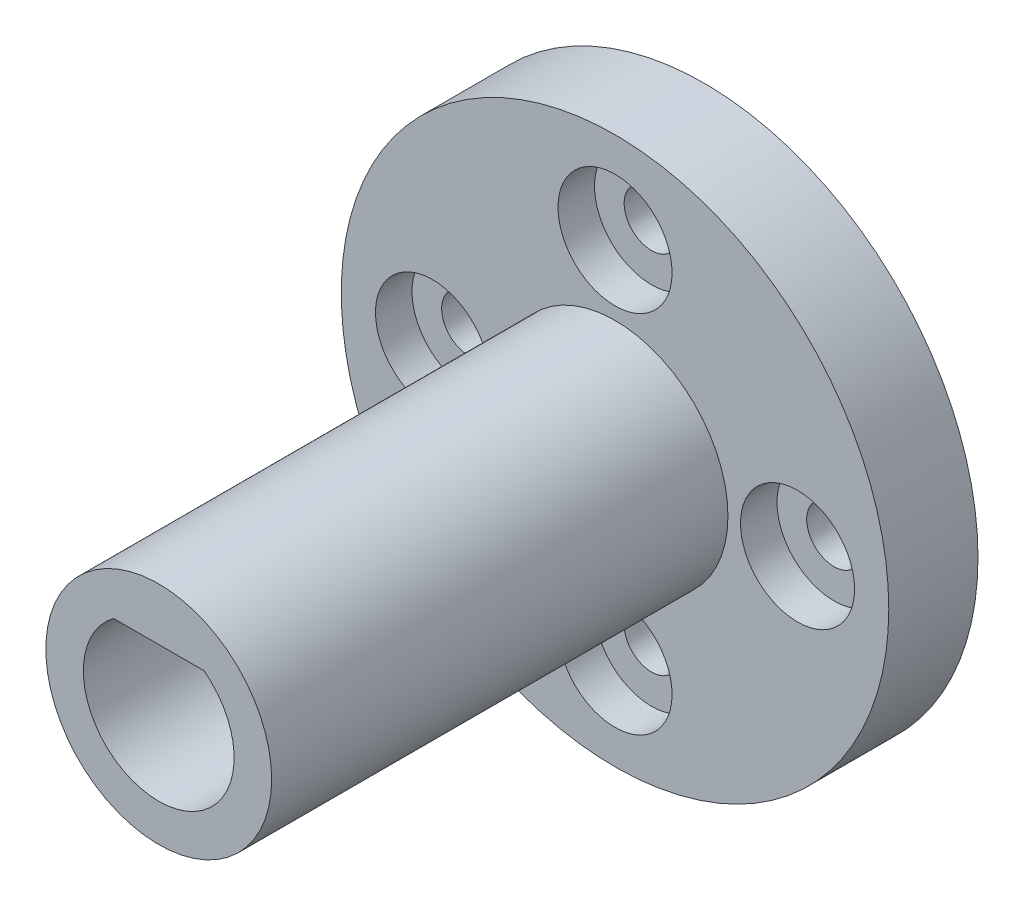
ISO-10303-21;
HEADER;
FILE_DESCRIPTION(('STEP AP214'),'2;1');
FILE_NAME('part.step','',(''),(''),'','','');
FILE_SCHEMA(('AUTOMOTIVE_DESIGN { 1 0 10303 214 1 1 1 1 }'));
ENDSEC;
DATA;
#1=APPLICATION_CONTEXT('core data for automotive mechanical design processes');
#2=APPLICATION_PROTOCOL_DEFINITION('international standard','automotive_design',2000,#1);
#3=PRODUCT_CONTEXT('',#1,'mechanical');
#4=PRODUCT('Part','Part','',(#3));
#5=PRODUCT_RELATED_PRODUCT_CATEGORY('part','',(#4));
#6=PRODUCT_DEFINITION_FORMATION('','',#4);
#7=PRODUCT_DEFINITION_CONTEXT('part definition',#1,'design');
#8=PRODUCT_DEFINITION('design','',#6,#7);
#9=PRODUCT_DEFINITION_SHAPE('','',#8);
#10=(LENGTH_UNIT() NAMED_UNIT(*) SI_UNIT(.MILLI.,.METRE.));
#11=(NAMED_UNIT(*) PLANE_ANGLE_UNIT() SI_UNIT($,.RADIAN.));
#12=(NAMED_UNIT(*) SI_UNIT($,.STERADIAN.) SOLID_ANGLE_UNIT());
#13=UNCERTAINTY_MEASURE_WITH_UNIT(LENGTH_MEASURE(1.E-05),#10,'distance_accuracy_value','');
#14=(GEOMETRIC_REPRESENTATION_CONTEXT(3) GLOBAL_UNCERTAINTY_ASSIGNED_CONTEXT((#13)) GLOBAL_UNIT_ASSIGNED_CONTEXT((#10,
#11,#12)) REPRESENTATION_CONTEXT('',''));
#15=CARTESIAN_POINT('',(0.,0.,0.));
#16=DIRECTION('',(0.,0.,1.));
#17=DIRECTION('',(1.,0.,0.));
#18=AXIS2_PLACEMENT_3D('',#15,#16,#17);
#19=CARTESIAN_POINT('',(0.,0.,3.91));
#20=DIRECTION('',(0.,0.,-1.));
#21=DIRECTION('',(-1.,0.,0.));
#22=AXIS2_PLACEMENT_3D('',#19,#20,#21);
#23=CYLINDRICAL_SURFACE('',#22,12.);
#24=CARTESIAN_POINT('',(0.,0.,3.91));
#25=DIRECTION('',(0.,0.,1.));
#26=DIRECTION('',(1.,0.,0.));
#27=AXIS2_PLACEMENT_3D('',#24,#25,#26);
#28=CIRCLE('',#27,12.);
#29=CARTESIAN_POINT('',(12.,0.,3.91));
#30=VERTEX_POINT('',#29);
#31=EDGE_CURVE('E11',#30,#30,#28,.T.);
#32=ORIENTED_EDGE('',*,*,#31,.F.);
#33=EDGE_LOOP('',(#32));
#34=FACE_BOUND('',#33,.T.);
#35=CARTESIAN_POINT('',(0.,0.,0.));
#36=DIRECTION('',(0.,0.,1.));
#37=DIRECTION('',(1.,0.,0.));
#38=AXIS2_PLACEMENT_3D('',#35,#36,#37);
#39=CIRCLE('',#38,12.);
#40=CARTESIAN_POINT('',(12.,0.,0.));
#41=VERTEX_POINT('',#40);
#42=EDGE_CURVE('E40',#41,#41,#39,.T.);
#43=ORIENTED_EDGE('',*,*,#42,.T.);
#44=EDGE_LOOP('',(#43));
#45=FACE_BOUND('',#44,.T.);
#46=ADVANCED_FACE('F37',(#34,#45),#23,.T.);
#47=CARTESIAN_POINT('',(0.,0.,3.91));
#48=DIRECTION('',(0.,0.,1.));
#49=DIRECTION('',(1.,0.,0.));
#50=AXIS2_PLACEMENT_3D('',#47,#48,#49);
#51=PLANE('',#50);
#52=CARTESIAN_POINT('',(8.,0.,3.91));
#53=DIRECTION('',(0.,0.,1.));
#54=DIRECTION('',(1.,0.,0.));
#55=AXIS2_PLACEMENT_3D('',#52,#53,#54);
#56=CIRCLE('',#55,2.5);
#57=CARTESIAN_POINT('',(10.5,0.,3.91));
#58=VERTEX_POINT('',#57);
#59=EDGE_CURVE('E307',#58,#58,#56,.T.);
#60=ORIENTED_EDGE('',*,*,#59,.F.);
#61=EDGE_LOOP('',(#60));
#62=FACE_BOUND('',#61,.T.);
#63=CARTESIAN_POINT('',(0.,-8.,3.91));
#64=DIRECTION('',(0.,0.,1.));
#65=DIRECTION('',(1.,0.,0.));
#66=AXIS2_PLACEMENT_3D('',#63,#64,#65);
#67=CIRCLE('',#66,2.5);
#68=CARTESIAN_POINT('',(2.5,-8.,3.91));
#69=VERTEX_POINT('',#68);
#70=EDGE_CURVE('E317',#69,#69,#67,.T.);
#71=ORIENTED_EDGE('',*,*,#70,.F.);
#72=EDGE_LOOP('',(#71));
#73=FACE_BOUND('',#72,.T.);
#74=CARTESIAN_POINT('',(-8.,0.,3.91));
#75=DIRECTION('',(0.,0.,1.));
#76=DIRECTION('',(1.,0.,0.));
#77=AXIS2_PLACEMENT_3D('',#74,#75,#76);
#78=CIRCLE('',#77,2.5);
#79=CARTESIAN_POINT('',(-5.50000000000001,0.,3.91));
#80=VERTEX_POINT('',#79);
#81=EDGE_CURVE('E329',#80,#80,#78,.T.);
#82=ORIENTED_EDGE('',*,*,#81,.F.);
#83=EDGE_LOOP('',(#82));
#84=FACE_BOUND('',#83,.T.);
#85=CARTESIAN_POINT('',(0.,8.,3.91));
#86=DIRECTION('',(0.,0.,1.));
#87=DIRECTION('',(1.,0.,0.));
#88=AXIS2_PLACEMENT_3D('',#85,#86,#87);
#89=CIRCLE('',#88,2.5);
#90=CARTESIAN_POINT('',(2.5,8.,3.91));
#91=VERTEX_POINT('',#90);
#92=EDGE_CURVE('E341',#91,#91,#89,.T.);
#93=ORIENTED_EDGE('',*,*,#92,.F.);
#94=EDGE_LOOP('',(#93));
#95=FACE_BOUND('',#94,.T.);
#96=CARTESIAN_POINT('',(0.,0.,3.91));
#97=DIRECTION('',(0.,0.,1.));
#98=DIRECTION('',(1.,0.,0.));
#99=AXIS2_PLACEMENT_3D('',#96,#97,#98);
#100=CIRCLE('',#99,4.95);
#101=CARTESIAN_POINT('',(4.95,0.,3.91));
#102=VERTEX_POINT('',#101);
#103=EDGE_CURVE('E77',#102,#102,#100,.T.);
#104=ORIENTED_EDGE('',*,*,#103,.F.);
#105=EDGE_LOOP('',(#104));
#106=FACE_BOUND('',#105,.T.);
#107=ORIENTED_EDGE('',*,*,#31,.T.);
#108=EDGE_LOOP('',(#107));
#109=FACE_BOUND('',#108,.T.);
#110=ADVANCED_FACE('F96',(#62,#73,#84,#95,#106,#109),#51,.T.);
#111=CARTESIAN_POINT('',(0.,0.,0.));
#112=DIRECTION('',(0.,0.,1.));
#113=DIRECTION('',(1.,0.,0.));
#114=AXIS2_PLACEMENT_3D('',#111,#112,#113);
#115=PLANE('',#114);
#116=CARTESIAN_POINT('',(8.,0.,0.));
#117=DIRECTION('',(0.,0.,1.));
#118=DIRECTION('',(1.,0.,0.));
#119=AXIS2_PLACEMENT_3D('',#116,#117,#118);
#120=CIRCLE('',#119,1.2);
#121=CARTESIAN_POINT('',(9.2,0.,0.));
#122=VERTEX_POINT('',#121);
#123=EDGE_CURVE('E314',#122,#122,#120,.T.);
#124=ORIENTED_EDGE('',*,*,#123,.T.);
#125=EDGE_LOOP('',(#124));
#126=FACE_BOUND('',#125,.T.);
#127=CARTESIAN_POINT('',(0.,-8.,0.));
#128=DIRECTION('',(0.,0.,1.));
#129=DIRECTION('',(1.,0.,0.));
#130=AXIS2_PLACEMENT_3D('',#127,#128,#129);
#131=CIRCLE('',#130,1.2);
#132=CARTESIAN_POINT('',(1.2,-8.,0.));
#133=VERTEX_POINT('',#132);
#134=EDGE_CURVE('E326',#133,#133,#131,.T.);
#135=ORIENTED_EDGE('',*,*,#134,.T.);
#136=EDGE_LOOP('',(#135));
#137=FACE_BOUND('',#136,.T.);
#138=CARTESIAN_POINT('',(-8.,0.,0.));
#139=DIRECTION('',(0.,0.,1.));
#140=DIRECTION('',(1.,0.,0.));
#141=AXIS2_PLACEMENT_3D('',#138,#139,#140);
#142=CIRCLE('',#141,1.2);
#143=CARTESIAN_POINT('',(-6.8,0.,0.));
#144=VERTEX_POINT('',#143);
#145=EDGE_CURVE('E338',#144,#144,#142,.T.);
#146=ORIENTED_EDGE('',*,*,#145,.T.);
#147=EDGE_LOOP('',(#146));
#148=FACE_BOUND('',#147,.T.);
#149=CARTESIAN_POINT('',(0.,8.,0.));
#150=DIRECTION('',(0.,0.,1.));
#151=DIRECTION('',(1.,0.,0.));
#152=AXIS2_PLACEMENT_3D('',#149,#150,#151);
#153=CIRCLE('',#152,1.2);
#154=CARTESIAN_POINT('',(1.2,8.,0.));
#155=VERTEX_POINT('',#154);
#156=EDGE_CURVE('E67',#155,#155,#153,.T.);
#157=ORIENTED_EDGE('',*,*,#156,.T.);
#158=EDGE_LOOP('',(#157));
#159=FACE_BOUND('',#158,.T.);
#160=CARTESIAN_POINT('',(0.,0.,0.));
#161=DIRECTION('',(0.,0.,-1.));
#162=DIRECTION('',(-1.,0.,0.));
#163=AXIS2_PLACEMENT_3D('',#160,#161,#162);
#164=CIRCLE('',#163,4.);
#165=CARTESIAN_POINT('',(-4.,0.,0.));
#166=VERTEX_POINT('',#165);
#167=EDGE_CURVE('E84',#166,#166,#164,.T.);
#168=ORIENTED_EDGE('',*,*,#167,.F.);
#169=EDGE_LOOP('',(#168));
#170=FACE_BOUND('',#169,.T.);
#171=ORIENTED_EDGE('',*,*,#42,.F.);
#172=EDGE_LOOP('',(#171));
#173=FACE_BOUND('',#172,.T.);
#174=ADVANCED_FACE('F93',(#126,#137,#148,#159,#170,#173),#115,.F.);
#175=CARTESIAN_POINT('',(0.,0.,1.91));
#176=DIRECTION('',(0.,0.,-1.));
#177=DIRECTION('',(-1.,0.,0.));
#178=AXIS2_PLACEMENT_3D('',#175,#176,#177);
#179=CYLINDRICAL_SURFACE('',#178,4.);
#180=CARTESIAN_POINT('',(0.,0.,1.91));
#181=DIRECTION('',(0.,0.,-1.));
#182=DIRECTION('',(-1.,0.,0.));
#183=AXIS2_PLACEMENT_3D('',#180,#181,#182);
#184=CIRCLE('',#183,4.);
#185=CARTESIAN_POINT('',(-4.,0.,1.91));
#186=VERTEX_POINT('',#185);
#187=EDGE_CURVE('E85',#186,#186,#184,.T.);
#188=CARTESIAN_POINT('',(-4.,0.,1.91));
#189=CARTESIAN_POINT('',(-4.,0.,1.89010416666667));
#190=CARTESIAN_POINT('',(-4.,0.,1.87020833333333));
#191=CARTESIAN_POINT('',(-4.,0.,1.83041666666667));
#192=CARTESIAN_POINT('',(-4.,0.,1.81052083333333));
#193=CARTESIAN_POINT('',(-4.,0.,1.77072916666667));
#194=CARTESIAN_POINT('',(-4.,0.,1.75083333333333));
#195=CARTESIAN_POINT('',(-4.,0.,1.71104166666667));
#196=CARTESIAN_POINT('',(-4.,0.,1.69114583333333));
#197=CARTESIAN_POINT('',(-4.,0.,1.65135416666667));
#198=CARTESIAN_POINT('',(-4.,0.,1.63145833333333));
#199=CARTESIAN_POINT('',(-4.,0.,1.59166666666667));
#200=CARTESIAN_POINT('',(-4.,0.,1.57177083333333));
#201=CARTESIAN_POINT('',(-4.,0.,1.53197916666667));
#202=CARTESIAN_POINT('',(-4.,0.,1.51208333333333));
#203=CARTESIAN_POINT('',(-4.,0.,1.47229166666667));
#204=CARTESIAN_POINT('',(-4.,0.,1.45239583333333));
#205=CARTESIAN_POINT('',(-4.,0.,1.41260416666667));
#206=CARTESIAN_POINT('',(-4.,0.,1.39270833333333));
#207=CARTESIAN_POINT('',(-4.,0.,1.35291666666667));
#208=CARTESIAN_POINT('',(-4.,0.,1.33302083333333));
#209=CARTESIAN_POINT('',(-4.,0.,1.29322916666667));
#210=CARTESIAN_POINT('',(-4.,0.,1.27333333333333));
#211=CARTESIAN_POINT('',(-4.,0.,1.23354166666667));
#212=CARTESIAN_POINT('',(-4.,0.,1.21364583333333));
#213=CARTESIAN_POINT('',(-4.,0.,1.17385416666667));
#214=CARTESIAN_POINT('',(-4.,0.,1.15395833333333));
#215=CARTESIAN_POINT('',(-4.,0.,1.11416666666667));
#216=CARTESIAN_POINT('',(-4.,0.,1.09427083333333));
#217=CARTESIAN_POINT('',(-4.,0.,1.05447916666667));
#218=CARTESIAN_POINT('',(-4.,0.,1.03458333333333));
#219=CARTESIAN_POINT('',(-4.,0.,0.994791666666667));
#220=CARTESIAN_POINT('',(-4.,0.,0.974895833333334));
#221=CARTESIAN_POINT('',(-4.,0.,0.935104166666667));
#222=CARTESIAN_POINT('',(-4.,0.,0.915208333333333));
#223=CARTESIAN_POINT('',(-4.,0.,0.875416666666667));
#224=CARTESIAN_POINT('',(-4.,0.,0.855520833333333));
#225=CARTESIAN_POINT('',(-4.,0.,0.815729166666667));
#226=CARTESIAN_POINT('',(-4.,0.,0.795833333333333));
#227=CARTESIAN_POINT('',(-4.,0.,0.756041666666667));
#228=CARTESIAN_POINT('',(-4.,0.,0.736145833333333));
#229=CARTESIAN_POINT('',(-4.,0.,0.696354166666667));
#230=CARTESIAN_POINT('',(-4.,0.,0.676458333333333));
#231=CARTESIAN_POINT('',(-4.,0.,0.636666666666667));
#232=CARTESIAN_POINT('',(-4.,0.,0.616770833333333));
#233=CARTESIAN_POINT('',(-4.,0.,0.576979166666667));
#234=CARTESIAN_POINT('',(-4.,0.,0.557083333333333));
#235=CARTESIAN_POINT('',(-4.,0.,0.517291666666667));
#236=CARTESIAN_POINT('',(-4.,0.,0.497395833333333));
#237=CARTESIAN_POINT('',(-4.,0.,0.457604166666667));
#238=CARTESIAN_POINT('',(-4.,0.,0.437708333333333));
#239=CARTESIAN_POINT('',(-4.,0.,0.397916666666667));
#240=CARTESIAN_POINT('',(-4.,0.,0.378020833333333));
#241=CARTESIAN_POINT('',(-4.,0.,0.338229166666667));
#242=CARTESIAN_POINT('',(-4.,0.,0.318333333333333));
#243=CARTESIAN_POINT('',(-4.,0.,0.278541666666667));
#244=CARTESIAN_POINT('',(-4.,0.,0.258645833333333));
#245=CARTESIAN_POINT('',(-4.,0.,0.218854166666667));
#246=CARTESIAN_POINT('',(-4.,0.,0.198958333333333));
#247=CARTESIAN_POINT('',(-4.,0.,0.159166666666667));
#248=CARTESIAN_POINT('',(-4.,0.,0.139270833333333));
#249=CARTESIAN_POINT('',(-4.,0.,0.0994791666666668));
#250=CARTESIAN_POINT('',(-4.,0.,0.0795833333333334));
#251=CARTESIAN_POINT('',(-4.,0.,0.0397916666666667));
#252=CARTESIAN_POINT('',(-4.,0.,0.0198958333333334));
#253=CARTESIAN_POINT('',(-4.,0.,0.));
#254=B_SPLINE_CURVE_WITH_KNOTS('',3,(#188,#189,#190,#191,#192,#193,#194,#195,#196,#197,#198,
#199,#200,#201,#202,#203,#204,#205,#206,#207,#208,#209,#210,#211,#212,#213,#214,#215,#216,#217,
#218,#219,#220,#221,#222,#223,#224,#225,#226,#227,#228,#229,#230,#231,#232,#233,#234,#235,#236,
#237,#238,#239,#240,#241,#242,#243,#244,#245,#246,#247,#248,#249,#250,#251,#252,#253),
.UNSPECIFIED.,.F.,.F.,(4,2,2,2,2,2,2,2,2,2,2,2,2,2,2,2,2,2,2,2,2,2,2,2,2,2,2,2,2,2,2,2,4),(0.,
0.0596874999999998,0.119375,0.1790625,0.23875,0.2984375,0.358125,0.4178125,0.4775,0.5371875,
0.596875,0.6565625,0.71625,0.7759375,0.835625,0.8953125,0.955,1.0146875,1.074375,1.1340625,
1.19375,1.2534375,1.313125,1.3728125,1.4325,1.4921875,1.551875,1.6115625,1.67125,1.7309375,
1.790625,1.8503125,1.91),.UNSPECIFIED.);
#255=EDGE_CURVE('BSEAM91',#186,#166,#254,.T.);
#256=ORIENTED_EDGE('',*,*,#187,.F.);
#257=ORIENTED_EDGE('',*,*,#167,.T.);
#258=ORIENTED_EDGE('',*,*,#255,.T.);
#259=ORIENTED_EDGE('',*,*,#255,.F.);
#260=EDGE_LOOP('',(#256,#258,#257,#259));
#261=FACE_BOUND('',#260,.T.);
#262=ADVANCED_FACE('F91',(#261),#179,.F.);
#263=CARTESIAN_POINT('',(0.,0.,1.91));
#264=DIRECTION('',(0.,0.,-1.));
#265=DIRECTION('',(-1.,0.,0.));
#266=AXIS2_PLACEMENT_3D('',#263,#264,#265);
#267=PLANE('',#266);
#268=ORIENTED_EDGE('',*,*,#187,.T.);
#269=EDGE_LOOP('',(#268));
#270=FACE_BOUND('',#269,.T.);
#271=ADVANCED_FACE('F140',(#270),#267,.T.);
#272=CARTESIAN_POINT('',(0.,2.645,23.91));
#273=DIRECTION('',(0.,-1.,0.));
#274=DIRECTION('',(0.,0.,-1.));
#275=AXIS2_PLACEMENT_3D('',#272,#273,#274);
#276=PLANE('',#275);
#277=DIRECTION('',(-1.,0.,0.));
#278=VECTOR('',#277,1.);
#279=CARTESIAN_POINT('',(0.,2.645,3.91));
#280=LINE('',#279,#278);
#281=CARTESIAN_POINT('',(1.98166596579747,2.645,3.91));
#282=VERTEX_POINT('',#281);
#283=CARTESIAN_POINT('',(-1.98166596579747,2.645,3.91));
#284=VERTEX_POINT('',#283);
#285=EDGE_CURVE('E64',#282,#284,#280,.T.);
#286=ORIENTED_EDGE('',*,*,#285,.F.);
#287=DIRECTION('',(0.,0.,-1.));
#288=VECTOR('',#287,1.);
#289=CARTESIAN_POINT('',(1.98166596579747,2.645,23.91));
#290=LINE('',#289,#288);
#291=CARTESIAN_POINT('',(1.98166596579747,2.645,23.91));
#292=VERTEX_POINT('',#291);
#293=EDGE_CURVE('E73',#292,#282,#290,.T.);
#294=ORIENTED_EDGE('',*,*,#293,.F.);
#295=DIRECTION('',(-1.,0.,0.));
#296=VECTOR('',#295,1.);
#297=CARTESIAN_POINT('',(0.,2.645,23.91));
#298=LINE('',#297,#296);
#299=CARTESIAN_POINT('',(-1.98166596579747,2.645,23.91));
#300=VERTEX_POINT('',#299);
#301=EDGE_CURVE('E71',#292,#300,#298,.T.);
#302=ORIENTED_EDGE('',*,*,#301,.T.);
#303=DIRECTION('',(0.,0.,-1.));
#304=VECTOR('',#303,1.);
#305=CARTESIAN_POINT('',(-1.98166596579747,2.645,23.91));
#306=LINE('',#305,#304);
#307=EDGE_CURVE('E58',#300,#284,#306,.T.);
#308=ORIENTED_EDGE('',*,*,#307,.T.);
#309=EDGE_LOOP('',(#286,#294,#302,#308));
#310=FACE_BOUND('',#309,.T.);
#311=ADVANCED_FACE('F69',(#310),#276,.T.);
#312=CARTESIAN_POINT('',(0.,0.,23.91));
#313=DIRECTION('',(0.,0.,-1.));
#314=DIRECTION('',(-1.,0.,0.));
#315=AXIS2_PLACEMENT_3D('',#312,#313,#314);
#316=CYLINDRICAL_SURFACE('',#315,3.305);
#317=CARTESIAN_POINT('',(0.,0.,3.91));
#318=DIRECTION('',(0.,0.,1.));
#319=DIRECTION('',(1.,0.,0.));
#320=AXIS2_PLACEMENT_3D('',#317,#318,#319);
#321=CIRCLE('',#320,3.305);
#322=EDGE_CURVE('E50',#284,#282,#321,.T.);
#323=ORIENTED_EDGE('',*,*,#322,.F.);
#324=ORIENTED_EDGE('',*,*,#307,.F.);
#325=CARTESIAN_POINT('',(0.,0.,23.91));
#326=DIRECTION('',(0.,0.,1.));
#327=DIRECTION('',(1.,0.,0.));
#328=AXIS2_PLACEMENT_3D('',#325,#326,#327);
#329=CIRCLE('',#328,3.305);
#330=EDGE_CURVE('E353',#300,#292,#329,.T.);
#331=ORIENTED_EDGE('',*,*,#330,.T.);
#332=ORIENTED_EDGE('',*,*,#293,.T.);
#333=EDGE_LOOP('',(#323,#324,#331,#332));
#334=FACE_BOUND('',#333,.T.);
#335=ADVANCED_FACE('F76',(#334),#316,.F.);
#336=CARTESIAN_POINT('',(0.,0.,23.91));
#337=DIRECTION('',(0.,0.,-1.));
#338=DIRECTION('',(-1.,0.,0.));
#339=AXIS2_PLACEMENT_3D('',#336,#337,#338);
#340=CYLINDRICAL_SURFACE('',#339,4.95);
#341=CARTESIAN_POINT('',(0.,0.,23.91));
#342=DIRECTION('',(0.,0.,1.));
#343=DIRECTION('',(1.,0.,0.));
#344=AXIS2_PLACEMENT_3D('',#341,#342,#343);
#345=CIRCLE('',#344,4.95);
#346=CARTESIAN_POINT('',(4.95,0.,23.91));
#347=VERTEX_POINT('',#346);
#348=EDGE_CURVE('E74',#347,#347,#345,.T.);
#349=ORIENTED_EDGE('',*,*,#348,.F.);
#350=EDGE_LOOP('',(#349));
#351=FACE_BOUND('',#350,.T.);
#352=ORIENTED_EDGE('',*,*,#103,.T.);
#353=EDGE_LOOP('',(#352));
#354=FACE_BOUND('',#353,.T.);
#355=ADVANCED_FACE('F125',(#351,#354),#340,.T.);
#356=CARTESIAN_POINT('',(0.,0.,23.91));
#357=DIRECTION('',(0.,0.,1.));
#358=DIRECTION('',(1.,0.,0.));
#359=AXIS2_PLACEMENT_3D('',#356,#357,#358);
#360=PLANE('',#359);
#361=ORIENTED_EDGE('',*,*,#301,.F.);
#362=ORIENTED_EDGE('',*,*,#330,.F.);
#363=EDGE_LOOP('',(#361,#362));
#364=FACE_BOUND('',#363,.T.);
#365=ORIENTED_EDGE('',*,*,#348,.T.);
#366=EDGE_LOOP('',(#365));
#367=FACE_BOUND('',#366,.T.);
#368=ADVANCED_FACE('F117',(#364,#367),#360,.T.);
#369=ORIENTED_EDGE('',*,*,#285,.T.);
#370=ORIENTED_EDGE('',*,*,#322,.T.);
#371=EDGE_LOOP('',(#369,#370));
#372=FACE_BOUND('',#371,.T.);
#373=ADVANCED_FACE('F65',(#372),#51,.T.);
#374=CARTESIAN_POINT('',(0.,8.,3.91));
#375=DIRECTION('',(0.,0.,1.));
#376=DIRECTION('',(1.,0.,0.));
#377=AXIS2_PLACEMENT_3D('',#374,#375,#376);
#378=CYLINDRICAL_SURFACE('',#377,1.2);
#379=ORIENTED_EDGE('',*,*,#156,.F.);
#380=EDGE_LOOP('',(#379));
#381=FACE_BOUND('',#380,.T.);
#382=CARTESIAN_POINT('',(0.,8.,2.31));
#383=DIRECTION('',(0.,0.,1.));
#384=DIRECTION('',(1.,0.,0.));
#385=AXIS2_PLACEMENT_3D('',#382,#383,#384);
#386=CIRCLE('',#385,1.2);
#387=CARTESIAN_POINT('',(1.2,8.,2.31));
#388=VERTEX_POINT('',#387);
#389=EDGE_CURVE('E347',#388,#388,#386,.T.);
#390=ORIENTED_EDGE('',*,*,#389,.T.);
#391=EDGE_LOOP('',(#390));
#392=FACE_BOUND('',#391,.T.);
#393=ADVANCED_FACE('F116',(#381,#392),#378,.F.);
#394=CARTESIAN_POINT('',(1.2,8.,2.31));
#395=DIRECTION('',(0.,0.,-1.));
#396=DIRECTION('',(-1.,0.,0.));
#397=AXIS2_PLACEMENT_3D('',#394,#395,#396);
#398=PLANE('',#397);
#399=ORIENTED_EDGE('',*,*,#389,.F.);
#400=EDGE_LOOP('',(#399));
#401=FACE_BOUND('',#400,.T.);
#402=CARTESIAN_POINT('',(0.,8.,2.31));
#403=DIRECTION('',(0.,0.,1.));
#404=DIRECTION('',(1.,0.,0.));
#405=AXIS2_PLACEMENT_3D('',#402,#403,#404);
#406=CIRCLE('',#405,2.5);
#407=CARTESIAN_POINT('',(2.5,8.,2.31));
#408=VERTEX_POINT('',#407);
#409=EDGE_CURVE('E344',#408,#408,#406,.T.);
#410=ORIENTED_EDGE('',*,*,#409,.T.);
#411=EDGE_LOOP('',(#410));
#412=FACE_BOUND('',#411,.T.);
#413=ADVANCED_FACE('F122',(#401,#412),#398,.F.);
#414=CARTESIAN_POINT('',(0.,8.,3.91));
#415=DIRECTION('',(0.,0.,1.));
#416=DIRECTION('',(1.,0.,0.));
#417=AXIS2_PLACEMENT_3D('',#414,#415,#416);
#418=CYLINDRICAL_SURFACE('',#417,2.5);
#419=ORIENTED_EDGE('',*,*,#409,.F.);
#420=EDGE_LOOP('',(#419));
#421=FACE_BOUND('',#420,.T.);
#422=ORIENTED_EDGE('',*,*,#92,.T.);
#423=EDGE_LOOP('',(#422));
#424=FACE_BOUND('',#423,.T.);
#425=ADVANCED_FACE('F190',(#421,#424),#418,.F.);
#426=CARTESIAN_POINT('',(-8.,0.,3.91));
#427=DIRECTION('',(0.,0.,1.));
#428=DIRECTION('',(1.,0.,0.));
#429=AXIS2_PLACEMENT_3D('',#426,#427,#428);
#430=CYLINDRICAL_SURFACE('',#429,1.2);
#431=ORIENTED_EDGE('',*,*,#145,.F.);
#432=EDGE_LOOP('',(#431));
#433=FACE_BOUND('',#432,.T.);
#434=CARTESIAN_POINT('',(-8.,0.,2.31));
#435=DIRECTION('',(0.,0.,1.));
#436=DIRECTION('',(1.,0.,0.));
#437=AXIS2_PLACEMENT_3D('',#434,#435,#436);
#438=CIRCLE('',#437,1.2);
#439=CARTESIAN_POINT('',(-6.8,0.,2.31));
#440=VERTEX_POINT('',#439);
#441=EDGE_CURVE('E335',#440,#440,#438,.T.);
#442=ORIENTED_EDGE('',*,*,#441,.T.);
#443=EDGE_LOOP('',(#442));
#444=FACE_BOUND('',#443,.T.);
#445=ADVANCED_FACE('F198',(#433,#444),#430,.F.);
#446=CARTESIAN_POINT('',(-6.8,0.,2.31));
#447=DIRECTION('',(0.,0.,-1.));
#448=DIRECTION('',(-1.,0.,0.));
#449=AXIS2_PLACEMENT_3D('',#446,#447,#448);
#450=PLANE('',#449);
#451=ORIENTED_EDGE('',*,*,#441,.F.);
#452=EDGE_LOOP('',(#451));
#453=FACE_BOUND('',#452,.T.);
#454=CARTESIAN_POINT('',(-8.,0.,2.31));
#455=DIRECTION('',(0.,0.,1.));
#456=DIRECTION('',(1.,0.,0.));
#457=AXIS2_PLACEMENT_3D('',#454,#455,#456);
#458=CIRCLE('',#457,2.5);
#459=CARTESIAN_POINT('',(-5.5,0.,2.31));
#460=VERTEX_POINT('',#459);
#461=EDGE_CURVE('E332',#460,#460,#458,.T.);
#462=ORIENTED_EDGE('',*,*,#461,.T.);
#463=EDGE_LOOP('',(#462));
#464=FACE_BOUND('',#463,.T.);
#465=ADVANCED_FACE('F218',(#453,#464),#450,.F.);
#466=CARTESIAN_POINT('',(-8.,0.,3.91));
#467=DIRECTION('',(0.,0.,1.));
#468=DIRECTION('',(1.,0.,0.));
#469=AXIS2_PLACEMENT_3D('',#466,#467,#468);
#470=CYLINDRICAL_SURFACE('',#469,2.5);
#471=ORIENTED_EDGE('',*,*,#461,.F.);
#472=EDGE_LOOP('',(#471));
#473=FACE_BOUND('',#472,.T.);
#474=ORIENTED_EDGE('',*,*,#81,.T.);
#475=EDGE_LOOP('',(#474));
#476=FACE_BOUND('',#475,.T.);
#477=ADVANCED_FACE('F228',(#473,#476),#470,.F.);
#478=CARTESIAN_POINT('',(0.,-8.,3.91));
#479=DIRECTION('',(0.,0.,1.));
#480=DIRECTION('',(1.,0.,0.));
#481=AXIS2_PLACEMENT_3D('',#478,#479,#480);
#482=CYLINDRICAL_SURFACE('',#481,1.2);
#483=ORIENTED_EDGE('',*,*,#134,.F.);
#484=EDGE_LOOP('',(#483));
#485=FACE_BOUND('',#484,.T.);
#486=CARTESIAN_POINT('',(0.,-8.,2.31));
#487=DIRECTION('',(0.,0.,1.));
#488=DIRECTION('',(1.,0.,0.));
#489=AXIS2_PLACEMENT_3D('',#486,#487,#488);
#490=CIRCLE('',#489,1.2);
#491=CARTESIAN_POINT('',(1.2,-8.,2.31));
#492=VERTEX_POINT('',#491);
#493=EDGE_CURVE('E323',#492,#492,#490,.T.);
#494=ORIENTED_EDGE('',*,*,#493,.T.);
#495=EDGE_LOOP('',(#494));
#496=FACE_BOUND('',#495,.T.);
#497=ADVANCED_FACE('F238',(#485,#496),#482,.F.);
#498=CARTESIAN_POINT('',(1.2,-8.,2.31));
#499=DIRECTION('',(0.,0.,-1.));
#500=DIRECTION('',(-1.,0.,0.));
#501=AXIS2_PLACEMENT_3D('',#498,#499,#500);
#502=PLANE('',#501);
#503=ORIENTED_EDGE('',*,*,#493,.F.);
#504=EDGE_LOOP('',(#503));
#505=FACE_BOUND('',#504,.T.);
#506=CARTESIAN_POINT('',(0.,-8.,2.31));
#507=DIRECTION('',(0.,0.,1.));
#508=DIRECTION('',(1.,0.,0.));
#509=AXIS2_PLACEMENT_3D('',#506,#507,#508);
#510=CIRCLE('',#509,2.5);
#511=CARTESIAN_POINT('',(2.5,-8.,2.31));
#512=VERTEX_POINT('',#511);
#513=EDGE_CURVE('E320',#512,#512,#510,.T.);
#514=ORIENTED_EDGE('',*,*,#513,.T.);
#515=EDGE_LOOP('',(#514));
#516=FACE_BOUND('',#515,.T.);
#517=ADVANCED_FACE('F248',(#505,#516),#502,.F.);
#518=CARTESIAN_POINT('',(0.,-8.,3.91));
#519=DIRECTION('',(0.,0.,1.));
#520=DIRECTION('',(1.,0.,0.));
#521=AXIS2_PLACEMENT_3D('',#518,#519,#520);
#522=CYLINDRICAL_SURFACE('',#521,2.5);
#523=ORIENTED_EDGE('',*,*,#513,.F.);
#524=EDGE_LOOP('',(#523));
#525=FACE_BOUND('',#524,.T.);
#526=ORIENTED_EDGE('',*,*,#70,.T.);
#527=EDGE_LOOP('',(#526));
#528=FACE_BOUND('',#527,.T.);
#529=ADVANCED_FACE('F258',(#525,#528),#522,.F.);
#530=CARTESIAN_POINT('',(8.,0.,3.91));
#531=DIRECTION('',(0.,0.,1.));
#532=DIRECTION('',(1.,0.,0.));
#533=AXIS2_PLACEMENT_3D('',#530,#531,#532);
#534=CYLINDRICAL_SURFACE('',#533,1.2);
#535=ORIENTED_EDGE('',*,*,#123,.F.);
#536=EDGE_LOOP('',(#535));
#537=FACE_BOUND('',#536,.T.);
#538=CARTESIAN_POINT('',(8.,0.,2.31));
#539=DIRECTION('',(0.,0.,1.));
#540=DIRECTION('',(1.,0.,0.));
#541=AXIS2_PLACEMENT_3D('',#538,#539,#540);
#542=CIRCLE('',#541,1.2);
#543=CARTESIAN_POINT('',(9.2,0.,2.31));
#544=VERTEX_POINT('',#543);
#545=EDGE_CURVE('E309',#544,#544,#542,.T.);
#546=ORIENTED_EDGE('',*,*,#545,.T.);
#547=EDGE_LOOP('',(#546));
#548=FACE_BOUND('',#547,.T.);
#549=ADVANCED_FACE('F268',(#537,#548),#534,.F.);
#550=CARTESIAN_POINT('',(9.2,0.,2.31));
#551=DIRECTION('',(0.,0.,-1.));
#552=DIRECTION('',(-1.,0.,0.));
#553=AXIS2_PLACEMENT_3D('',#550,#551,#552);
#554=PLANE('',#553);
#555=ORIENTED_EDGE('',*,*,#545,.F.);
#556=EDGE_LOOP('',(#555));
#557=FACE_BOUND('',#556,.T.);
#558=CARTESIAN_POINT('',(8.,0.,2.31));
#559=DIRECTION('',(0.,0.,1.));
#560=DIRECTION('',(1.,0.,0.));
#561=AXIS2_PLACEMENT_3D('',#558,#559,#560);
#562=CIRCLE('',#561,2.5);
#563=CARTESIAN_POINT('',(10.5,0.,2.31));
#564=VERTEX_POINT('',#563);
#565=EDGE_CURVE('E305',#564,#564,#562,.T.);
#566=ORIENTED_EDGE('',*,*,#565,.T.);
#567=EDGE_LOOP('',(#566));
#568=FACE_BOUND('',#567,.T.);
#569=ADVANCED_FACE('F278',(#557,#568),#554,.F.);
#570=CARTESIAN_POINT('',(8.,0.,3.91));
#571=DIRECTION('',(0.,0.,1.));
#572=DIRECTION('',(1.,0.,0.));
#573=AXIS2_PLACEMENT_3D('',#570,#571,#572);
#574=CYLINDRICAL_SURFACE('',#573,2.5);
#575=ORIENTED_EDGE('',*,*,#565,.F.);
#576=EDGE_LOOP('',(#575));
#577=FACE_BOUND('',#576,.T.);
#578=ORIENTED_EDGE('',*,*,#59,.T.);
#579=EDGE_LOOP('',(#578));
#580=FACE_BOUND('',#579,.T.);
#581=ADVANCED_FACE('F288',(#577,#580),#574,.F.);
#582=CLOSED_SHELL('',(#46,#110,#174,#262,#271,#311,#335,#355,#368,#373,#393,#413,#425,#445,#465,
#477,#497,#517,#529,#549,#569,#581));
#583=MANIFOLD_SOLID_BREP('B2',#582);
#584=ADVANCED_BREP_SHAPE_REPRESENTATION('',(#18,#583),#14);
#585=SHAPE_DEFINITION_REPRESENTATION(#9,#584);
ENDSEC;
END-ISO-10303-21;
